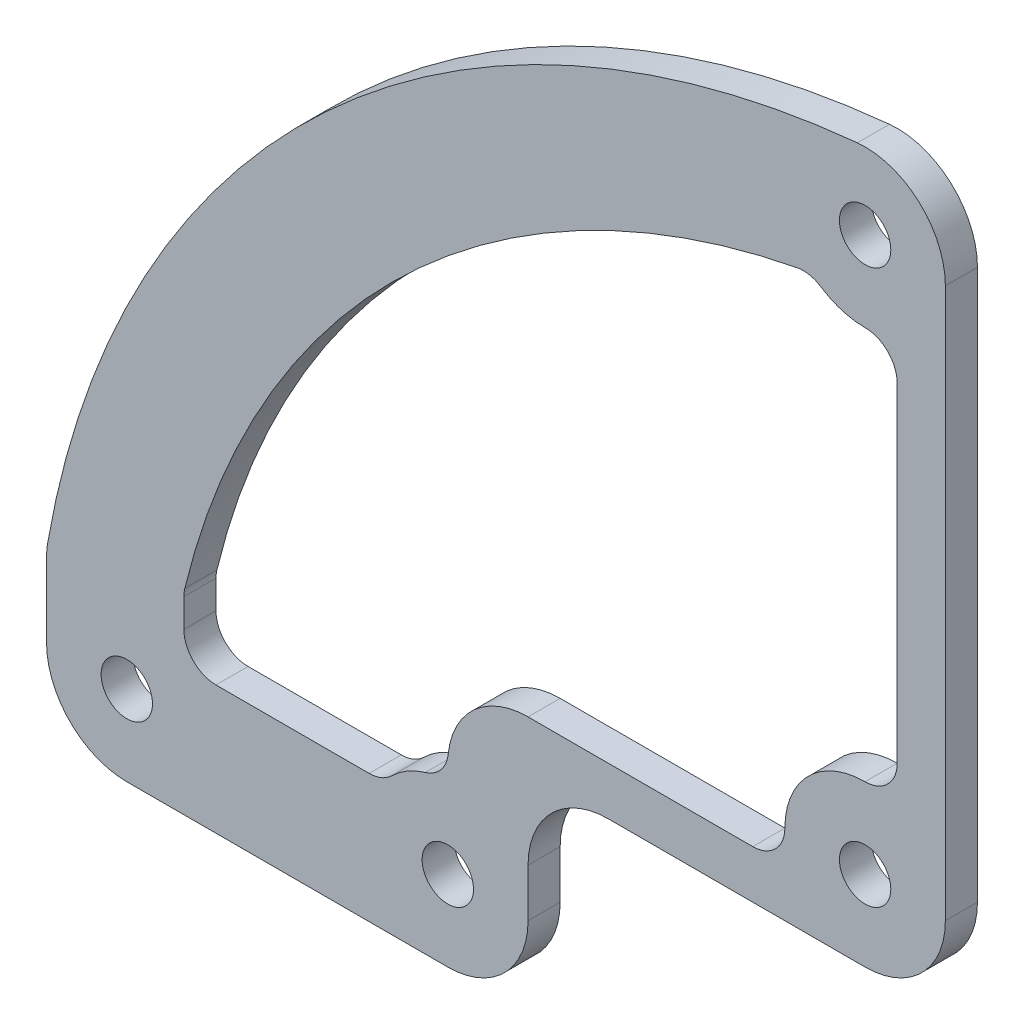
ISO-10303-21;
HEADER;
FILE_DESCRIPTION(('STEP AP214'),'2;1');
FILE_NAME('part.step','',(''),(''),'','','');
FILE_SCHEMA(('AUTOMOTIVE_DESIGN { 1 0 10303 214 1 1 1 1 }'));
ENDSEC;
DATA;
#1=APPLICATION_CONTEXT('core data for automotive mechanical design processes');
#2=APPLICATION_PROTOCOL_DEFINITION('international standard','automotive_design',2000,#1);
#3=PRODUCT_CONTEXT('',#1,'mechanical');
#4=PRODUCT('Part','Part','',(#3));
#5=PRODUCT_RELATED_PRODUCT_CATEGORY('part','',(#4));
#6=PRODUCT_DEFINITION_FORMATION('','',#4);
#7=PRODUCT_DEFINITION_CONTEXT('part definition',#1,'design');
#8=PRODUCT_DEFINITION('design','',#6,#7);
#9=PRODUCT_DEFINITION_SHAPE('','',#8);
#10=(LENGTH_UNIT() NAMED_UNIT(*) SI_UNIT(.MILLI.,.METRE.));
#11=(NAMED_UNIT(*) PLANE_ANGLE_UNIT() SI_UNIT($,.RADIAN.));
#12=(NAMED_UNIT(*) SI_UNIT($,.STERADIAN.) SOLID_ANGLE_UNIT());
#13=UNCERTAINTY_MEASURE_WITH_UNIT(LENGTH_MEASURE(1.E-05),#10,'distance_accuracy_value','');
#14=(GEOMETRIC_REPRESENTATION_CONTEXT(3) GLOBAL_UNCERTAINTY_ASSIGNED_CONTEXT((#13)) GLOBAL_UNIT_ASSIGNED_CONTEXT((#10,
#11,#12)) REPRESENTATION_CONTEXT('',''));
#15=CARTESIAN_POINT('',(0.,0.,0.));
#16=DIRECTION('',(0.,0.,1.));
#17=DIRECTION('',(1.,0.,0.));
#18=AXIS2_PLACEMENT_3D('',#15,#16,#17);
#19=CARTESIAN_POINT('',(26.,0.739473684210526,2.));
#20=DIRECTION('',(0.,0.,1.));
#21=DIRECTION('',(1.,0.,0.));
#22=AXIS2_PLACEMENT_3D('',#19,#20,#21);
#23=PLANE('',#22);
#24=CARTESIAN_POINT('',(21.,18.,2.));
#25=DIRECTION('',(0.,0.,1.));
#26=DIRECTION('',(1.,0.,0.));
#27=AXIS2_PLACEMENT_3D('',#24,#25,#26);
#28=CIRCLE('',#27,1.6);
#29=CARTESIAN_POINT('',(22.6,18.,2.));
#30=VERTEX_POINT('',#29);
#31=EDGE_CURVE('E481',#30,#30,#28,.T.);
#32=ORIENTED_EDGE('',*,*,#31,.F.);
#33=EDGE_LOOP('',(#32));
#34=FACE_BOUND('',#33,.T.);
#35=CARTESIAN_POINT('',(-25.,5.,2.));
#36=DIRECTION('',(0.,0.,1.));
#37=DIRECTION('',(1.,0.,0.));
#38=AXIS2_PLACEMENT_3D('',#35,#36,#37);
#39=CIRCLE('',#38,1.6);
#40=CARTESIAN_POINT('',(-23.4,5.,2.));
#41=VERTEX_POINT('',#40);
#42=EDGE_CURVE('E264',#41,#41,#39,.T.);
#43=ORIENTED_EDGE('',*,*,#42,.F.);
#44=EDGE_LOOP('',(#43));
#45=FACE_BOUND('',#44,.T.);
#46=DIRECTION('',(0.,1.,0.));
#47=VECTOR('',#46,1.);
#48=CARTESIAN_POINT('',(26.,13.,2.));
#49=LINE('',#48,#47);
#50=CARTESIAN_POINT('',(26.,18.,2.));
#51=VERTEX_POINT('',#50);
#52=CARTESIAN_POINT('',(26.,52.2579372141678,2.));
#53=VERTEX_POINT('',#52);
#54=EDGE_CURVE('E308',#51,#53,#49,.T.);
#55=ORIENTED_EDGE('',*,*,#54,.T.);
#56=CARTESIAN_POINT('',(21.,52.2579372141678,2.));
#57=DIRECTION('',(0.,0.,1.));
#58=DIRECTION('',(1.,0.,0.));
#59=AXIS2_PLACEMENT_3D('',#56,#57,#58);
#60=CIRCLE('',#59,5.);
#61=CARTESIAN_POINT('',(20.5170064568611,57.2345542616495,2.));
#62=VERTEX_POINT('',#61);
#63=EDGE_CURVE('E355',#53,#62,#60,.T.);
#64=ORIENTED_EDGE('',*,*,#63,.T.);
#65=CARTESIAN_POINT('',(26.,0.739473684210526,2.));
#66=DIRECTION('',(0.,0.,1.));
#67=DIRECTION('',(1.,0.,0.));
#68=AXIS2_PLACEMENT_3D('',#65,#66,#67);
#69=CIRCLE('',#68,56.7605263157895);
#70=CARTESIAN_POINT('',(-29.9265341400173,10.4338084592691,2.));
#71=VERTEX_POINT('',#70);
#72=EDGE_CURVE('E292',#62,#71,#69,.T.);
#73=ORIENTED_EDGE('',*,*,#72,.T.);
#74=CARTESIAN_POINT('',(-25.,9.57984044625919,2.));
#75=DIRECTION('',(0.,0.,1.));
#76=DIRECTION('',(1.,0.,0.));
#77=AXIS2_PLACEMENT_3D('',#74,#75,#76);
#78=CIRCLE('',#77,5.);
#79=CARTESIAN_POINT('',(-30.,9.57984044625919,2.));
#80=VERTEX_POINT('',#79);
#81=EDGE_CURVE('E347',#71,#80,#78,.T.);
#82=ORIENTED_EDGE('',*,*,#81,.T.);
#83=DIRECTION('',(0.,-1.,0.));
#84=VECTOR('',#83,1.);
#85=CARTESIAN_POINT('',(-30.,10.,2.));
#86=LINE('',#85,#84);
#87=CARTESIAN_POINT('',(-30.,5.,2.));
#88=VERTEX_POINT('',#87);
#89=EDGE_CURVE('E295',#80,#88,#86,.T.);
#90=ORIENTED_EDGE('',*,*,#89,.T.);
#91=CARTESIAN_POINT('',(-25.,5.,2.));
#92=DIRECTION('',(0.,0.,1.));
#93=DIRECTION('',(1.,0.,0.));
#94=AXIS2_PLACEMENT_3D('',#91,#92,#93);
#95=CIRCLE('',#94,5.);
#96=CARTESIAN_POINT('',(-25.,0.,2.));
#97=VERTEX_POINT('',#96);
#98=EDGE_CURVE('E349',#88,#97,#95,.T.);
#99=ORIENTED_EDGE('',*,*,#98,.T.);
#100=DIRECTION('',(1.,0.,0.));
#101=VECTOR('',#100,1.);
#102=CARTESIAN_POINT('',(-30.,0.,2.));
#103=LINE('',#102,#101);
#104=CARTESIAN_POINT('',(-5.,0.,2.));
#105=VERTEX_POINT('',#104);
#106=EDGE_CURVE('E299',#97,#105,#103,.T.);
#107=ORIENTED_EDGE('',*,*,#106,.T.);
#108=CARTESIAN_POINT('',(-5.,5.,2.));
#109=DIRECTION('',(0.,0.,1.));
#110=DIRECTION('',(1.,0.,0.));
#111=AXIS2_PLACEMENT_3D('',#108,#109,#110);
#112=CIRCLE('',#111,5.);
#113=CARTESIAN_POINT('',(0.,5.,2.));
#114=VERTEX_POINT('',#113);
#115=EDGE_CURVE('E351',#105,#114,#112,.T.);
#116=ORIENTED_EDGE('',*,*,#115,.T.);
#117=DIRECTION('',(0.,1.,0.));
#118=VECTOR('',#117,1.);
#119=CARTESIAN_POINT('',(0.,0.,2.));
#120=LINE('',#119,#118);
#121=CARTESIAN_POINT('',(0.,7.99999999999999,2.));
#122=VERTEX_POINT('',#121);
#123=EDGE_CURVE('E302',#114,#122,#120,.T.);
#124=ORIENTED_EDGE('',*,*,#123,.T.);
#125=CARTESIAN_POINT('',(5.,8.,2.));
#126=DIRECTION('',(0.,0.,1.));
#127=DIRECTION('',(1.,0.,0.));
#128=AXIS2_PLACEMENT_3D('',#125,#126,#127);
#129=CIRCLE('',#128,5.);
#130=CARTESIAN_POINT('',(5.,13.,2.));
#131=VERTEX_POINT('',#130);
#132=EDGE_CURVE('E379',#122,#131,#129,.F.);
#133=ORIENTED_EDGE('',*,*,#132,.T.);
#134=DIRECTION('',(1.,0.,0.));
#135=VECTOR('',#134,1.);
#136=CARTESIAN_POINT('',(0.,13.,2.));
#137=LINE('',#136,#135);
#138=CARTESIAN_POINT('',(21.,13.,2.));
#139=VERTEX_POINT('',#138);
#140=EDGE_CURVE('E305',#131,#139,#137,.T.);
#141=ORIENTED_EDGE('',*,*,#140,.T.);
#142=CARTESIAN_POINT('',(21.,18.,2.));
#143=DIRECTION('',(0.,0.,1.));
#144=DIRECTION('',(1.,0.,0.));
#145=AXIS2_PLACEMENT_3D('',#142,#143,#144);
#146=CIRCLE('',#145,5.);
#147=EDGE_CURVE('E353',#139,#51,#146,.T.);
#148=ORIENTED_EDGE('',*,*,#147,.T.);
#149=EDGE_LOOP('',(#55,#64,#73,#82,#90,#99,#107,#116,#124,#133,#141,#148));
#150=FACE_BOUND('',#149,.T.);
#151=DIRECTION('',(0.,-1.,0.));
#152=VECTOR('',#151,1.);
#153=CARTESIAN_POINT('',(-21.442485955989,8.,2.));
#154=LINE('',#153,#152);
#155=CARTESIAN_POINT('',(-21.442485955989,11.7634154234155,2.));
#156=VERTEX_POINT('',#155);
#157=CARTESIAN_POINT('',(-21.442485955989,10.,2.));
#158=VERTEX_POINT('',#157);
#159=EDGE_CURVE('E465',#156,#158,#154,.T.);
#160=ORIENTED_EDGE('',*,*,#159,.F.);
#161=CARTESIAN_POINT('',(-19.442485955989,11.7634154234155,2.));
#162=DIRECTION('',(0.,0.,1.));
#163=DIRECTION('',(1.,0.,0.));
#164=AXIS2_PLACEMENT_3D('',#161,#162,#163);
#165=CIRCLE('',#164,2.);
#166=CARTESIAN_POINT('',(-21.3861118959153,12.2349217390098,2.));
#167=VERTEX_POINT('',#166);
#168=EDGE_CURVE('E426',#156,#167,#165,.F.);
#169=ORIENTED_EDGE('',*,*,#168,.T.);
#170=CARTESIAN_POINT('',(26.,0.739473684210526,2.));
#171=DIRECTION('',(0.,0.,1.));
#172=DIRECTION('',(-1.,0.,0.));
#173=AXIS2_PLACEMENT_3D('',#170,#171,#172);
#174=CIRCLE('',#173,48.7605263157895);
#175=CARTESIAN_POINT('',(16.7702138952018,48.6184876157074,2.));
#176=VERTEX_POINT('',#175);
#177=EDGE_CURVE('E285',#176,#167,#174,.T.);
#178=ORIENTED_EDGE('',*,*,#177,.F.);
#179=CARTESIAN_POINT('',(17.1487900428432,46.654644419208,2.));
#180=DIRECTION('',(0.,0.,1.));
#181=DIRECTION('',(1.,0.,0.));
#182=AXIS2_PLACEMENT_3D('',#179,#180,#181);
#183=CIRCLE('',#182,2.);
#184=CARTESIAN_POINT('',(18.249135744888,48.32474601372,2.));
#185=VERTEX_POINT('',#184);
#186=EDGE_CURVE('E430',#176,#185,#183,.F.);
#187=ORIENTED_EDGE('',*,*,#186,.T.);
#188=CARTESIAN_POINT('',(21.,52.5,2.));
#189=DIRECTION('',(0.,0.,-1.));
#190=DIRECTION('',(-1.,0.,0.));
#191=AXIS2_PLACEMENT_3D('',#188,#189,#190);
#192=CIRCLE('',#191,5.);
#193=CARTESIAN_POINT('',(21.,47.5,2.));
#194=VERTEX_POINT('',#193);
#195=EDGE_CURVE('E256',#194,#185,#192,.T.);
#196=ORIENTED_EDGE('',*,*,#195,.F.);
#197=CARTESIAN_POINT('',(21.,45.5,2.));
#198=DIRECTION('',(0.,0.,1.));
#199=DIRECTION('',(1.,0.,0.));
#200=AXIS2_PLACEMENT_3D('',#197,#198,#199);
#201=CIRCLE('',#200,2.);
#202=CARTESIAN_POINT('',(23.,45.5,2.));
#203=VERTEX_POINT('',#202);
#204=EDGE_CURVE('E434',#194,#203,#201,.F.);
#205=ORIENTED_EDGE('',*,*,#204,.T.);
#206=DIRECTION('',(0.,1.,0.));
#207=VECTOR('',#206,1.);
#208=CARTESIAN_POINT('',(23.,23.,2.));
#209=LINE('',#208,#207);
#210=CARTESIAN_POINT('',(23.,25.,2.));
#211=VERTEX_POINT('',#210);
#212=EDGE_CURVE('E250',#211,#203,#209,.T.);
#213=ORIENTED_EDGE('',*,*,#212,.F.);
#214=CARTESIAN_POINT('',(21.,25.,2.));
#215=DIRECTION('',(0.,0.,1.));
#216=DIRECTION('',(1.,0.,0.));
#217=AXIS2_PLACEMENT_3D('',#214,#215,#216);
#218=CIRCLE('',#217,2.);
#219=CARTESIAN_POINT('',(21.,23.,2.));
#220=VERTEX_POINT('',#219);
#221=EDGE_CURVE('E11',#211,#220,#218,.F.);
#222=ORIENTED_EDGE('',*,*,#221,.T.);
#223=CARTESIAN_POINT('',(21.,18.,2.));
#224=DIRECTION('',(0.,0.,-1.));
#225=DIRECTION('',(-1.,0.,0.));
#226=AXIS2_PLACEMENT_3D('',#223,#224,#225);
#227=CIRCLE('',#226,5.);
#228=CARTESIAN_POINT('',(16.,18.,2.));
#229=VERTEX_POINT('',#228);
#230=EDGE_CURVE('E247',#229,#220,#227,.T.);
#231=ORIENTED_EDGE('',*,*,#230,.F.);
#232=CARTESIAN_POINT('',(14.,18.,2.));
#233=DIRECTION('',(0.,0.,1.));
#234=DIRECTION('',(1.,0.,0.));
#235=AXIS2_PLACEMENT_3D('',#232,#233,#234);
#236=CIRCLE('',#235,2.);
#237=CARTESIAN_POINT('',(14.,16.,2.));
#238=VERTEX_POINT('',#237);
#239=EDGE_CURVE('E48',#229,#238,#236,.F.);
#240=ORIENTED_EDGE('',*,*,#239,.T.);
#241=DIRECTION('',(1.,0.,0.));
#242=VECTOR('',#241,1.);
#243=CARTESIAN_POINT('',(0.,16.,2.));
#244=LINE('',#243,#242);
#245=CARTESIAN_POINT('',(0.,16.,2.));
#246=VERTEX_POINT('',#245);
#247=EDGE_CURVE('E235',#246,#238,#244,.T.);
#248=ORIENTED_EDGE('',*,*,#247,.F.);
#249=CARTESIAN_POINT('',(0.,11.,2.));
#250=DIRECTION('',(0.,0.,-1.));
#251=DIRECTION('',(1.,0.,0.));
#252=AXIS2_PLACEMENT_3D('',#249,#250,#251);
#253=CIRCLE('',#252,5.);
#254=CARTESIAN_POINT('',(-4.97354452366013,11.5136680554311,2.));
#255=VERTEX_POINT('',#254);
#256=EDGE_CURVE('E226',#255,#246,#253,.T.);
#257=ORIENTED_EDGE('',*,*,#256,.F.);
#258=CARTESIAN_POINT('',(-6.96296233312418,11.7191352776035,2.));
#259=DIRECTION('',(0.,0.,1.));
#260=DIRECTION('',(1.,0.,0.));
#261=AXIS2_PLACEMENT_3D('',#258,#259,#260);
#262=CIRCLE('',#261,2.);
#263=CARTESIAN_POINT('',(-6.40211595223156,9.79938234114535,2.));
#264=VERTEX_POINT('',#263);
#265=EDGE_CURVE('E414',#255,#264,#262,.F.);
#266=ORIENTED_EDGE('',*,*,#265,.T.);
#267=CARTESIAN_POINT('',(-5.,4.99999999999998,2.));
#268=DIRECTION('',(0.,0.,-1.));
#269=DIRECTION('',(-1.,0.,0.));
#270=AXIS2_PLACEMENT_3D('',#267,#268,#269);
#271=CIRCLE('',#270,5.00000000000002);
#272=CARTESIAN_POINT('',(-8.49927106111883,8.57142857142857,2.));
#273=VERTEX_POINT('',#272);
#274=EDGE_CURVE('E236',#273,#264,#271,.T.);
#275=ORIENTED_EDGE('',*,*,#274,.F.);
#276=CARTESIAN_POINT('',(-9.89897948556636,10.,2.));
#277=DIRECTION('',(0.,0.,1.));
#278=DIRECTION('',(1.,0.,0.));
#279=AXIS2_PLACEMENT_3D('',#276,#277,#278);
#280=CIRCLE('',#279,2.);
#281=CARTESIAN_POINT('',(-9.89897948556636,8.,2.));
#282=VERTEX_POINT('',#281);
#283=EDGE_CURVE('E418',#273,#282,#280,.F.);
#284=ORIENTED_EDGE('',*,*,#283,.T.);
#285=DIRECTION('',(1.,0.,0.));
#286=VECTOR('',#285,1.);
#287=CARTESIAN_POINT('',(-9.,8.,2.));
#288=LINE('',#287,#286);
#289=CARTESIAN_POINT('',(-19.442485955989,8.,2.));
#290=VERTEX_POINT('',#289);
#291=EDGE_CURVE('E463',#290,#282,#288,.T.);
#292=ORIENTED_EDGE('',*,*,#291,.F.);
#293=CARTESIAN_POINT('',(-19.442485955989,10.,2.));
#294=DIRECTION('',(0.,0.,1.));
#295=DIRECTION('',(1.,0.,0.));
#296=AXIS2_PLACEMENT_3D('',#293,#294,#295);
#297=CIRCLE('',#296,2.);
#298=EDGE_CURVE('E422',#290,#158,#297,.F.);
#299=ORIENTED_EDGE('',*,*,#298,.T.);
#300=EDGE_LOOP('',(#160,#169,#178,#187,#196,#205,#213,#222,#231,#240,#248,#257,#266,#275,#284,
#292,#299));
#301=FACE_BOUND('',#300,.T.);
#302=CARTESIAN_POINT('',(-5.,4.99999999999998,2.));
#303=DIRECTION('',(0.,0.,1.));
#304=DIRECTION('',(1.,0.,0.));
#305=AXIS2_PLACEMENT_3D('',#302,#303,#304);
#306=CIRCLE('',#305,1.6);
#307=CARTESIAN_POINT('',(-3.4,4.99999999999998,2.));
#308=VERTEX_POINT('',#307);
#309=EDGE_CURVE('E475',#308,#308,#306,.T.);
#310=ORIENTED_EDGE('',*,*,#309,.F.);
#311=EDGE_LOOP('',(#310));
#312=FACE_BOUND('',#311,.T.);
#313=CARTESIAN_POINT('',(21.,52.5,2.));
#314=DIRECTION('',(0.,0.,1.));
#315=DIRECTION('',(1.,0.,0.));
#316=AXIS2_PLACEMENT_3D('',#313,#314,#315);
#317=CIRCLE('',#316,1.6);
#318=CARTESIAN_POINT('',(22.6,52.5,2.));
#319=VERTEX_POINT('',#318);
#320=EDGE_CURVE('E487',#319,#319,#317,.T.);
#321=ORIENTED_EDGE('',*,*,#320,.F.);
#322=EDGE_LOOP('',(#321));
#323=FACE_BOUND('',#322,.T.);
#324=ADVANCED_FACE('F33',(#34,#45,#150,#301,#312,#323),#23,.T.);
#325=CARTESIAN_POINT('',(26.,0.739473684210526,0.));
#326=DIRECTION('',(0.,0.,1.));
#327=DIRECTION('',(1.,0.,0.));
#328=AXIS2_PLACEMENT_3D('',#325,#326,#327);
#329=PLANE('',#328);
#330=CARTESIAN_POINT('',(26.,0.739473684210526,0.));
#331=DIRECTION('',(0.,0.,1.));
#332=DIRECTION('',(1.,0.,0.));
#333=AXIS2_PLACEMENT_3D('',#330,#331,#332);
#334=CIRCLE('',#333,56.7605263157895);
#335=CARTESIAN_POINT('',(20.5170064568611,57.2345542616495,0.));
#336=VERTEX_POINT('',#335);
#337=CARTESIAN_POINT('',(-29.9265341400173,10.4338084592691,0.));
#338=VERTEX_POINT('',#337);
#339=EDGE_CURVE('E242',#336,#338,#334,.T.);
#340=ORIENTED_EDGE('',*,*,#339,.F.);
#341=CARTESIAN_POINT('',(21.,52.2579372141678,0.));
#342=DIRECTION('',(0.,0.,1.));
#343=DIRECTION('',(1.,0.,0.));
#344=AXIS2_PLACEMENT_3D('',#341,#342,#343);
#345=CIRCLE('',#344,5.);
#346=CARTESIAN_POINT('',(26.,52.2579372141678,0.));
#347=VERTEX_POINT('',#346);
#348=EDGE_CURVE('E340',#336,#347,#345,.F.);
#349=ORIENTED_EDGE('',*,*,#348,.T.);
#350=DIRECTION('',(0.,1.,0.));
#351=VECTOR('',#350,1.);
#352=CARTESIAN_POINT('',(26.,13.,0.));
#353=LINE('',#352,#351);
#354=CARTESIAN_POINT('',(26.,18.,0.));
#355=VERTEX_POINT('',#354);
#356=EDGE_CURVE('E296',#355,#347,#353,.T.);
#357=ORIENTED_EDGE('',*,*,#356,.F.);
#358=CARTESIAN_POINT('',(21.,18.,0.));
#359=DIRECTION('',(0.,0.,1.));
#360=DIRECTION('',(1.,0.,0.));
#361=AXIS2_PLACEMENT_3D('',#358,#359,#360);
#362=CIRCLE('',#361,5.);
#363=CARTESIAN_POINT('',(21.,13.,0.));
#364=VERTEX_POINT('',#363);
#365=EDGE_CURVE('E338',#355,#364,#362,.F.);
#366=ORIENTED_EDGE('',*,*,#365,.T.);
#367=DIRECTION('',(1.,0.,0.));
#368=VECTOR('',#367,1.);
#369=CARTESIAN_POINT('',(0.,13.,0.));
#370=LINE('',#369,#368);
#371=CARTESIAN_POINT('',(5.,13.,0.));
#372=VERTEX_POINT('',#371);
#373=EDGE_CURVE('E323',#372,#364,#370,.T.);
#374=ORIENTED_EDGE('',*,*,#373,.F.);
#375=CARTESIAN_POINT('',(5.,8.,0.));
#376=DIRECTION('',(0.,0.,1.));
#377=DIRECTION('',(1.,0.,0.));
#378=AXIS2_PLACEMENT_3D('',#375,#376,#377);
#379=CIRCLE('',#378,5.);
#380=CARTESIAN_POINT('',(0.,7.99999999999999,0.));
#381=VERTEX_POINT('',#380);
#382=EDGE_CURVE('E377',#372,#381,#379,.T.);
#383=ORIENTED_EDGE('',*,*,#382,.T.);
#384=DIRECTION('',(0.,1.,0.));
#385=VECTOR('',#384,1.);
#386=CARTESIAN_POINT('',(0.,0.,0.));
#387=LINE('',#386,#385);
#388=CARTESIAN_POINT('',(0.,5.,0.));
#389=VERTEX_POINT('',#388);
#390=EDGE_CURVE('E320',#389,#381,#387,.T.);
#391=ORIENTED_EDGE('',*,*,#390,.F.);
#392=CARTESIAN_POINT('',(-5.,5.,0.));
#393=DIRECTION('',(0.,0.,1.));
#394=DIRECTION('',(1.,0.,0.));
#395=AXIS2_PLACEMENT_3D('',#392,#393,#394);
#396=CIRCLE('',#395,5.);
#397=CARTESIAN_POINT('',(-5.,0.,0.));
#398=VERTEX_POINT('',#397);
#399=EDGE_CURVE('E336',#389,#398,#396,.F.);
#400=ORIENTED_EDGE('',*,*,#399,.T.);
#401=DIRECTION('',(1.,0.,0.));
#402=VECTOR('',#401,1.);
#403=CARTESIAN_POINT('',(-30.,0.,0.));
#404=LINE('',#403,#402);
#405=CARTESIAN_POINT('',(-25.,0.,0.));
#406=VERTEX_POINT('',#405);
#407=EDGE_CURVE('E317',#406,#398,#404,.T.);
#408=ORIENTED_EDGE('',*,*,#407,.F.);
#409=CARTESIAN_POINT('',(-25.,5.,0.));
#410=DIRECTION('',(0.,0.,1.));
#411=DIRECTION('',(1.,0.,0.));
#412=AXIS2_PLACEMENT_3D('',#409,#410,#411);
#413=CIRCLE('',#412,5.);
#414=CARTESIAN_POINT('',(-30.,5.,0.));
#415=VERTEX_POINT('',#414);
#416=EDGE_CURVE('E334',#406,#415,#413,.F.);
#417=ORIENTED_EDGE('',*,*,#416,.T.);
#418=DIRECTION('',(0.,-1.,0.));
#419=VECTOR('',#418,1.);
#420=CARTESIAN_POINT('',(-30.,10.,0.));
#421=LINE('',#420,#419);
#422=CARTESIAN_POINT('',(-30.,9.57984044625919,0.));
#423=VERTEX_POINT('',#422);
#424=EDGE_CURVE('E314',#423,#415,#421,.T.);
#425=ORIENTED_EDGE('',*,*,#424,.F.);
#426=CARTESIAN_POINT('',(-25.,9.57984044625919,0.));
#427=DIRECTION('',(0.,0.,1.));
#428=DIRECTION('',(1.,0.,0.));
#429=AXIS2_PLACEMENT_3D('',#426,#427,#428);
#430=CIRCLE('',#429,5.);
#431=EDGE_CURVE('E332',#423,#338,#430,.F.);
#432=ORIENTED_EDGE('',*,*,#431,.T.);
#433=EDGE_LOOP('',(#340,#349,#357,#366,#374,#383,#391,#400,#408,#417,#425,#432));
#434=FACE_BOUND('',#433,.T.);
#435=CARTESIAN_POINT('',(21.,52.5,0.));
#436=DIRECTION('',(0.,0.,-1.));
#437=DIRECTION('',(-1.,0.,0.));
#438=AXIS2_PLACEMENT_3D('',#435,#436,#437);
#439=CIRCLE('',#438,5.);
#440=CARTESIAN_POINT('',(21.,47.5,0.));
#441=VERTEX_POINT('',#440);
#442=CARTESIAN_POINT('',(18.249135744888,48.32474601372,0.));
#443=VERTEX_POINT('',#442);
#444=EDGE_CURVE('E282',#441,#443,#439,.T.);
#445=ORIENTED_EDGE('',*,*,#444,.T.);
#446=CARTESIAN_POINT('',(17.1487900428432,46.654644419208,0.));
#447=DIRECTION('',(0.,0.,1.));
#448=DIRECTION('',(1.,0.,0.));
#449=AXIS2_PLACEMENT_3D('',#446,#447,#448);
#450=CIRCLE('',#449,2.);
#451=CARTESIAN_POINT('',(16.7702138952018,48.6184876157074,0.));
#452=VERTEX_POINT('',#451);
#453=EDGE_CURVE('E428',#443,#452,#450,.T.);
#454=ORIENTED_EDGE('',*,*,#453,.T.);
#455=CARTESIAN_POINT('',(26.,0.739473684210526,0.));
#456=DIRECTION('',(0.,0.,1.));
#457=DIRECTION('',(-1.,0.,0.));
#458=AXIS2_PLACEMENT_3D('',#455,#456,#457);
#459=CIRCLE('',#458,48.7605263157895);
#460=CARTESIAN_POINT('',(-21.3861118959153,12.2349217390098,0.));
#461=VERTEX_POINT('',#460);
#462=EDGE_CURVE('E260',#452,#461,#459,.T.);
#463=ORIENTED_EDGE('',*,*,#462,.T.);
#464=CARTESIAN_POINT('',(-19.442485955989,11.7634154234155,0.));
#465=DIRECTION('',(0.,0.,1.));
#466=DIRECTION('',(1.,0.,0.));
#467=AXIS2_PLACEMENT_3D('',#464,#465,#466);
#468=CIRCLE('',#467,2.);
#469=CARTESIAN_POINT('',(-21.442485955989,11.7634154234155,0.));
#470=VERTEX_POINT('',#469);
#471=EDGE_CURVE('E424',#461,#470,#468,.T.);
#472=ORIENTED_EDGE('',*,*,#471,.T.);
#473=DIRECTION('',(0.,-1.,0.));
#474=VECTOR('',#473,1.);
#475=CARTESIAN_POINT('',(-21.442485955989,8.,0.));
#476=LINE('',#475,#474);
#477=CARTESIAN_POINT('',(-21.442485955989,10.,0.));
#478=VERTEX_POINT('',#477);
#479=EDGE_CURVE('E263',#470,#478,#476,.T.);
#480=ORIENTED_EDGE('',*,*,#479,.T.);
#481=CARTESIAN_POINT('',(-19.442485955989,10.,0.));
#482=DIRECTION('',(0.,0.,1.));
#483=DIRECTION('',(1.,0.,0.));
#484=AXIS2_PLACEMENT_3D('',#481,#482,#483);
#485=CIRCLE('',#484,2.);
#486=CARTESIAN_POINT('',(-19.442485955989,8.,0.));
#487=VERTEX_POINT('',#486);
#488=EDGE_CURVE('E420',#478,#487,#485,.T.);
#489=ORIENTED_EDGE('',*,*,#488,.T.);
#490=DIRECTION('',(1.,0.,0.));
#491=VECTOR('',#490,1.);
#492=CARTESIAN_POINT('',(-9.,8.,0.));
#493=LINE('',#492,#491);
#494=CARTESIAN_POINT('',(-9.89897948556636,8.,0.));
#495=VERTEX_POINT('',#494);
#496=EDGE_CURVE('E267',#487,#495,#493,.T.);
#497=ORIENTED_EDGE('',*,*,#496,.T.);
#498=CARTESIAN_POINT('',(-9.89897948556636,10.,0.));
#499=DIRECTION('',(0.,0.,1.));
#500=DIRECTION('',(1.,0.,0.));
#501=AXIS2_PLACEMENT_3D('',#498,#499,#500);
#502=CIRCLE('',#501,2.);
#503=CARTESIAN_POINT('',(-8.49927106111883,8.57142857142857,0.));
#504=VERTEX_POINT('',#503);
#505=EDGE_CURVE('E416',#495,#504,#502,.T.);
#506=ORIENTED_EDGE('',*,*,#505,.T.);
#507=CARTESIAN_POINT('',(-5.,4.99999999999998,0.));
#508=DIRECTION('',(0.,0.,-1.));
#509=DIRECTION('',(-1.,0.,0.));
#510=AXIS2_PLACEMENT_3D('',#507,#508,#509);
#511=CIRCLE('',#510,5.00000000000002);
#512=CARTESIAN_POINT('',(-6.40211595223156,9.79938234114535,0.));
#513=VERTEX_POINT('',#512);
#514=EDGE_CURVE('E270',#504,#513,#511,.T.);
#515=ORIENTED_EDGE('',*,*,#514,.T.);
#516=CARTESIAN_POINT('',(-6.96296233312418,11.7191352776035,0.));
#517=DIRECTION('',(0.,0.,1.));
#518=DIRECTION('',(1.,0.,0.));
#519=AXIS2_PLACEMENT_3D('',#516,#517,#518);
#520=CIRCLE('',#519,2.);
#521=CARTESIAN_POINT('',(-4.97354452366013,11.5136680554311,0.));
#522=VERTEX_POINT('',#521);
#523=EDGE_CURVE('E412',#513,#522,#520,.T.);
#524=ORIENTED_EDGE('',*,*,#523,.T.);
#525=CARTESIAN_POINT('',(0.,11.,0.));
#526=DIRECTION('',(0.,0.,-1.));
#527=DIRECTION('',(1.,0.,0.));
#528=AXIS2_PLACEMENT_3D('',#525,#526,#527);
#529=CIRCLE('',#528,5.);
#530=CARTESIAN_POINT('',(0.,16.,0.));
#531=VERTEX_POINT('',#530);
#532=EDGE_CURVE('E273',#522,#531,#529,.T.);
#533=ORIENTED_EDGE('',*,*,#532,.T.);
#534=DIRECTION('',(1.,0.,0.));
#535=VECTOR('',#534,1.);
#536=CARTESIAN_POINT('',(0.,16.,0.));
#537=LINE('',#536,#535);
#538=CARTESIAN_POINT('',(14.,16.,0.));
#539=VERTEX_POINT('',#538);
#540=EDGE_CURVE('E241',#531,#539,#537,.T.);
#541=ORIENTED_EDGE('',*,*,#540,.T.);
#542=CARTESIAN_POINT('',(14.,18.,0.));
#543=DIRECTION('',(0.,0.,1.));
#544=DIRECTION('',(1.,0.,0.));
#545=AXIS2_PLACEMENT_3D('',#542,#543,#544);
#546=CIRCLE('',#545,2.);
#547=CARTESIAN_POINT('',(16.,18.,0.));
#548=VERTEX_POINT('',#547);
#549=EDGE_CURVE('E56',#539,#548,#546,.T.);
#550=ORIENTED_EDGE('',*,*,#549,.T.);
#551=CARTESIAN_POINT('',(21.,18.,0.));
#552=DIRECTION('',(0.,0.,-1.));
#553=DIRECTION('',(-1.,0.,0.));
#554=AXIS2_PLACEMENT_3D('',#551,#552,#553);
#555=CIRCLE('',#554,5.);
#556=CARTESIAN_POINT('',(21.,23.,0.));
#557=VERTEX_POINT('',#556);
#558=EDGE_CURVE('E276',#548,#557,#555,.T.);
#559=ORIENTED_EDGE('',*,*,#558,.T.);
#560=CARTESIAN_POINT('',(21.,25.,0.));
#561=DIRECTION('',(0.,0.,1.));
#562=DIRECTION('',(1.,0.,0.));
#563=AXIS2_PLACEMENT_3D('',#560,#561,#562);
#564=CIRCLE('',#563,2.);
#565=CARTESIAN_POINT('',(23.,25.,0.));
#566=VERTEX_POINT('',#565);
#567=EDGE_CURVE('E41',#557,#566,#564,.T.);
#568=ORIENTED_EDGE('',*,*,#567,.T.);
#569=DIRECTION('',(0.,1.,0.));
#570=VECTOR('',#569,1.);
#571=CARTESIAN_POINT('',(23.,23.,0.));
#572=LINE('',#571,#570);
#573=CARTESIAN_POINT('',(23.,45.5,0.));
#574=VERTEX_POINT('',#573);
#575=EDGE_CURVE('E279',#566,#574,#572,.T.);
#576=ORIENTED_EDGE('',*,*,#575,.T.);
#577=CARTESIAN_POINT('',(21.,45.5,0.));
#578=DIRECTION('',(0.,0.,1.));
#579=DIRECTION('',(1.,0.,0.));
#580=AXIS2_PLACEMENT_3D('',#577,#578,#579);
#581=CIRCLE('',#580,2.);
#582=EDGE_CURVE('E432',#574,#441,#581,.T.);
#583=ORIENTED_EDGE('',*,*,#582,.T.);
#584=EDGE_LOOP('',(#445,#454,#463,#472,#480,#489,#497,#506,#515,#524,#533,#541,#550,#559,#568,
#576,#583));
#585=FACE_BOUND('',#584,.T.);
#586=CARTESIAN_POINT('',(-25.,5.,0.));
#587=DIRECTION('',(0.,0.,1.));
#588=DIRECTION('',(1.,0.,0.));
#589=AXIS2_PLACEMENT_3D('',#586,#587,#588);
#590=CIRCLE('',#589,1.6);
#591=CARTESIAN_POINT('',(-23.4,5.,0.));
#592=VERTEX_POINT('',#591);
#593=EDGE_CURVE('E472',#592,#592,#590,.T.);
#594=ORIENTED_EDGE('',*,*,#593,.T.);
#595=EDGE_LOOP('',(#594));
#596=FACE_BOUND('',#595,.T.);
#597=CARTESIAN_POINT('',(-5.,4.99999999999998,0.));
#598=DIRECTION('',(0.,0.,1.));
#599=DIRECTION('',(1.,0.,0.));
#600=AXIS2_PLACEMENT_3D('',#597,#598,#599);
#601=CIRCLE('',#600,1.6);
#602=CARTESIAN_POINT('',(-3.4,4.99999999999998,0.));
#603=VERTEX_POINT('',#602);
#604=EDGE_CURVE('E478',#603,#603,#601,.T.);
#605=ORIENTED_EDGE('',*,*,#604,.T.);
#606=EDGE_LOOP('',(#605));
#607=FACE_BOUND('',#606,.T.);
#608=CARTESIAN_POINT('',(21.,18.,0.));
#609=DIRECTION('',(0.,0.,1.));
#610=DIRECTION('',(1.,0.,0.));
#611=AXIS2_PLACEMENT_3D('',#608,#609,#610);
#612=CIRCLE('',#611,1.6);
#613=CARTESIAN_POINT('',(22.6,18.,0.));
#614=VERTEX_POINT('',#613);
#615=EDGE_CURVE('E484',#614,#614,#612,.T.);
#616=ORIENTED_EDGE('',*,*,#615,.T.);
#617=EDGE_LOOP('',(#616));
#618=FACE_BOUND('',#617,.T.);
#619=CARTESIAN_POINT('',(21.,52.5,0.));
#620=DIRECTION('',(0.,0.,1.));
#621=DIRECTION('',(1.,0.,0.));
#622=AXIS2_PLACEMENT_3D('',#619,#620,#621);
#623=CIRCLE('',#622,1.6);
#624=CARTESIAN_POINT('',(22.6,52.5,0.));
#625=VERTEX_POINT('',#624);
#626=EDGE_CURVE('E490',#625,#625,#623,.T.);
#627=ORIENTED_EDGE('',*,*,#626,.T.);
#628=EDGE_LOOP('',(#627));
#629=FACE_BOUND('',#628,.T.);
#630=ADVANCED_FACE('F439',(#434,#585,#596,#607,#618,#629),#329,.F.);
#631=CARTESIAN_POINT('',(26.,0.739473684210526,2.));
#632=DIRECTION('',(0.,0.,-1.));
#633=DIRECTION('',(-1.,0.,0.));
#634=AXIS2_PLACEMENT_3D('',#631,#632,#633);
#635=CYLINDRICAL_SURFACE('',#634,56.7605263157895);
#636=ORIENTED_EDGE('',*,*,#72,.F.);
#637=DIRECTION('',(0.,0.,-1.));
#638=VECTOR('',#637,1.);
#639=CARTESIAN_POINT('',(20.5170064568611,57.2345542616495,2.));
#640=LINE('',#639,#638);
#641=EDGE_CURVE('E329',#62,#336,#640,.T.);
#642=ORIENTED_EDGE('',*,*,#641,.T.);
#643=ORIENTED_EDGE('',*,*,#339,.T.);
#644=DIRECTION('',(0.,0.,-1.));
#645=VECTOR('',#644,1.);
#646=CARTESIAN_POINT('',(-29.9265341400173,10.4338084592691,2.));
#647=LINE('',#646,#645);
#648=EDGE_CURVE('E311',#338,#71,#647,.F.);
#649=ORIENTED_EDGE('',*,*,#648,.T.);
#650=EDGE_LOOP('',(#636,#642,#643,#649));
#651=FACE_BOUND('',#650,.T.);
#652=ADVANCED_FACE('F505',(#651),#635,.T.);
#653=CARTESIAN_POINT('',(-30.,10.,2.));
#654=DIRECTION('',(1.,0.,0.));
#655=DIRECTION('',(0.,0.,-1.));
#656=AXIS2_PLACEMENT_3D('',#653,#654,#655);
#657=PLANE('',#656);
#658=ORIENTED_EDGE('',*,*,#424,.T.);
#659=DIRECTION('',(0.,0.,-1.));
#660=VECTOR('',#659,1.);
#661=CARTESIAN_POINT('',(-30.,5.,2.));
#662=LINE('',#661,#660);
#663=EDGE_CURVE('E375',#415,#88,#662,.F.);
#664=ORIENTED_EDGE('',*,*,#663,.T.);
#665=ORIENTED_EDGE('',*,*,#89,.F.);
#666=DIRECTION('',(0.,0.,-1.));
#667=VECTOR('',#666,1.);
#668=CARTESIAN_POINT('',(-30.,9.57984044625919,2.));
#669=LINE('',#668,#667);
#670=EDGE_CURVE('E372',#80,#423,#669,.T.);
#671=ORIENTED_EDGE('',*,*,#670,.T.);
#672=EDGE_LOOP('',(#658,#664,#665,#671));
#673=FACE_BOUND('',#672,.T.);
#674=ADVANCED_FACE('F529',(#673),#657,.F.);
#675=CARTESIAN_POINT('',(-30.,0.,2.));
#676=DIRECTION('',(0.,1.,0.));
#677=DIRECTION('',(0.,0.,1.));
#678=AXIS2_PLACEMENT_3D('',#675,#676,#677);
#679=PLANE('',#678);
#680=ORIENTED_EDGE('',*,*,#407,.T.);
#681=DIRECTION('',(0.,0.,-1.));
#682=VECTOR('',#681,1.);
#683=CARTESIAN_POINT('',(-5.,0.,2.));
#684=LINE('',#683,#682);
#685=EDGE_CURVE('E370',#398,#105,#684,.F.);
#686=ORIENTED_EDGE('',*,*,#685,.T.);
#687=ORIENTED_EDGE('',*,*,#106,.F.);
#688=DIRECTION('',(0.,0.,-1.));
#689=VECTOR('',#688,1.);
#690=CARTESIAN_POINT('',(-25.,0.,2.));
#691=LINE('',#690,#689);
#692=EDGE_CURVE('E367',#97,#406,#691,.T.);
#693=ORIENTED_EDGE('',*,*,#692,.T.);
#694=EDGE_LOOP('',(#680,#686,#687,#693));
#695=FACE_BOUND('',#694,.T.);
#696=ADVANCED_FACE('F525',(#695),#679,.F.);
#697=CARTESIAN_POINT('',(0.,0.,2.));
#698=DIRECTION('',(-1.,0.,0.));
#699=DIRECTION('',(0.,-1.,0.));
#700=AXIS2_PLACEMENT_3D('',#697,#698,#699);
#701=PLANE('',#700);
#702=ORIENTED_EDGE('',*,*,#390,.T.);
#703=DIRECTION('',(0.,0.,-1.));
#704=VECTOR('',#703,1.);
#705=CARTESIAN_POINT('',(0.,8.,2.));
#706=LINE('',#705,#704);
#707=EDGE_CURVE('E365',#381,#122,#706,.F.);
#708=ORIENTED_EDGE('',*,*,#707,.T.);
#709=ORIENTED_EDGE('',*,*,#123,.F.);
#710=DIRECTION('',(0.,0.,-1.));
#711=VECTOR('',#710,1.);
#712=CARTESIAN_POINT('',(0.,5.,2.));
#713=LINE('',#712,#711);
#714=EDGE_CURVE('E362',#114,#389,#713,.T.);
#715=ORIENTED_EDGE('',*,*,#714,.T.);
#716=EDGE_LOOP('',(#702,#708,#709,#715));
#717=FACE_BOUND('',#716,.T.);
#718=ADVANCED_FACE('F521',(#717),#701,.F.);
#719=CARTESIAN_POINT('',(0.,13.,2.));
#720=DIRECTION('',(0.,1.,0.));
#721=DIRECTION('',(0.,0.,1.));
#722=AXIS2_PLACEMENT_3D('',#719,#720,#721);
#723=PLANE('',#722);
#724=ORIENTED_EDGE('',*,*,#373,.T.);
#725=DIRECTION('',(0.,0.,-1.));
#726=VECTOR('',#725,1.);
#727=CARTESIAN_POINT('',(21.,13.,2.));
#728=LINE('',#727,#726);
#729=EDGE_CURVE('E360',#364,#139,#728,.F.);
#730=ORIENTED_EDGE('',*,*,#729,.T.);
#731=ORIENTED_EDGE('',*,*,#140,.F.);
#732=DIRECTION('',(0.,0.,-1.));
#733=VECTOR('',#732,1.);
#734=CARTESIAN_POINT('',(5.,13.,0.));
#735=LINE('',#734,#733);
#736=EDGE_CURVE('E357',#131,#372,#735,.T.);
#737=ORIENTED_EDGE('',*,*,#736,.T.);
#738=EDGE_LOOP('',(#724,#730,#731,#737));
#739=FACE_BOUND('',#738,.T.);
#740=ADVANCED_FACE('F517',(#739),#723,.F.);
#741=CARTESIAN_POINT('',(26.,13.,2.));
#742=DIRECTION('',(-1.,0.,0.));
#743=DIRECTION('',(0.,0.,1.));
#744=AXIS2_PLACEMENT_3D('',#741,#742,#743);
#745=PLANE('',#744);
#746=ORIENTED_EDGE('',*,*,#356,.T.);
#747=DIRECTION('',(0.,0.,-1.));
#748=VECTOR('',#747,1.);
#749=CARTESIAN_POINT('',(26.,52.2579372141678,2.));
#750=LINE('',#749,#748);
#751=EDGE_CURVE('E345',#347,#53,#750,.F.);
#752=ORIENTED_EDGE('',*,*,#751,.T.);
#753=ORIENTED_EDGE('',*,*,#54,.F.);
#754=DIRECTION('',(0.,0.,-1.));
#755=VECTOR('',#754,1.);
#756=CARTESIAN_POINT('',(26.,18.,2.));
#757=LINE('',#756,#755);
#758=EDGE_CURVE('E342',#51,#355,#757,.T.);
#759=ORIENTED_EDGE('',*,*,#758,.T.);
#760=EDGE_LOOP('',(#746,#752,#753,#759));
#761=FACE_BOUND('',#760,.T.);
#762=ADVANCED_FACE('F514',(#761),#745,.F.);
#763=CARTESIAN_POINT('',(26.,0.739473684210526,2.));
#764=DIRECTION('',(0.,0.,-1.));
#765=DIRECTION('',(-1.,0.,0.));
#766=AXIS2_PLACEMENT_3D('',#763,#764,#765);
#767=CYLINDRICAL_SURFACE('',#766,48.7605263157895);
#768=ORIENTED_EDGE('',*,*,#177,.T.);
#769=DIRECTION('',(0.,0.,-1.));
#770=VECTOR('',#769,1.);
#771=CARTESIAN_POINT('',(-21.3861118959153,12.2349217390098,2.));
#772=LINE('',#771,#770);
#773=EDGE_CURVE('E399',#167,#461,#772,.T.);
#774=ORIENTED_EDGE('',*,*,#773,.T.);
#775=ORIENTED_EDGE('',*,*,#462,.F.);
#776=DIRECTION('',(0.,0.,-1.));
#777=VECTOR('',#776,1.);
#778=CARTESIAN_POINT('',(16.7702138952018,48.6184876157074,2.));
#779=LINE('',#778,#777);
#780=EDGE_CURVE('E397',#452,#176,#779,.F.);
#781=ORIENTED_EDGE('',*,*,#780,.T.);
#782=EDGE_LOOP('',(#768,#774,#775,#781));
#783=FACE_BOUND('',#782,.T.);
#784=ADVANCED_FACE('F511',(#783),#767,.F.);
#785=CARTESIAN_POINT('',(-21.442485955989,8.,2.));
#786=DIRECTION('',(1.,0.,0.));
#787=DIRECTION('',(0.,0.,-1.));
#788=AXIS2_PLACEMENT_3D('',#785,#786,#787);
#789=PLANE('',#788);
#790=ORIENTED_EDGE('',*,*,#159,.T.);
#791=DIRECTION('',(0.,0.,-1.));
#792=VECTOR('',#791,1.);
#793=CARTESIAN_POINT('',(-21.442485955989,10.,0.));
#794=LINE('',#793,#792);
#795=EDGE_CURVE('E394',#158,#478,#794,.T.);
#796=ORIENTED_EDGE('',*,*,#795,.T.);
#797=ORIENTED_EDGE('',*,*,#479,.F.);
#798=DIRECTION('',(0.,0.,1.));
#799=VECTOR('',#798,1.);
#800=CARTESIAN_POINT('',(-21.442485955989,11.7634154234155,2.));
#801=LINE('',#800,#799);
#802=EDGE_CURVE('E392',#470,#156,#801,.T.);
#803=ORIENTED_EDGE('',*,*,#802,.T.);
#804=EDGE_LOOP('',(#790,#796,#797,#803));
#805=FACE_BOUND('',#804,.T.);
#806=ADVANCED_FACE('F692',(#805),#789,.T.);
#807=CARTESIAN_POINT('',(-9.,8.,2.));
#808=DIRECTION('',(0.,1.,0.));
#809=DIRECTION('',(0.,0.,1.));
#810=AXIS2_PLACEMENT_3D('',#807,#808,#809);
#811=PLANE('',#810);
#812=ORIENTED_EDGE('',*,*,#291,.T.);
#813=DIRECTION('',(0.,0.,1.));
#814=VECTOR('',#813,1.);
#815=CARTESIAN_POINT('',(-9.89897948556636,8.,0.));
#816=LINE('',#815,#814);
#817=EDGE_CURVE('E389',#282,#495,#816,.F.);
#818=ORIENTED_EDGE('',*,*,#817,.T.);
#819=ORIENTED_EDGE('',*,*,#496,.F.);
#820=DIRECTION('',(0.,0.,-1.));
#821=VECTOR('',#820,1.);
#822=CARTESIAN_POINT('',(-19.442485955989,8.,2.));
#823=LINE('',#822,#821);
#824=EDGE_CURVE('E387',#487,#290,#823,.F.);
#825=ORIENTED_EDGE('',*,*,#824,.T.);
#826=EDGE_LOOP('',(#812,#818,#819,#825));
#827=FACE_BOUND('',#826,.T.);
#828=ADVANCED_FACE('F683',(#827),#811,.T.);
#829=CARTESIAN_POINT('',(-5.,4.99999999999998,2.));
#830=DIRECTION('',(0.,0.,-1.));
#831=DIRECTION('',(-1.,0.,0.));
#832=AXIS2_PLACEMENT_3D('',#829,#830,#831);
#833=CYLINDRICAL_SURFACE('',#832,5.00000000000002);
#834=ORIENTED_EDGE('',*,*,#274,.T.);
#835=DIRECTION('',(0.,0.,-1.));
#836=VECTOR('',#835,1.);
#837=CARTESIAN_POINT('',(-6.40211595223156,9.79938234114535,2.));
#838=LINE('',#837,#836);
#839=EDGE_CURVE('E383',#264,#513,#838,.T.);
#840=ORIENTED_EDGE('',*,*,#839,.T.);
#841=ORIENTED_EDGE('',*,*,#514,.F.);
#842=DIRECTION('',(0.,0.,-1.));
#843=VECTOR('',#842,1.);
#844=CARTESIAN_POINT('',(-8.49927106111883,8.57142857142857,2.));
#845=LINE('',#844,#843);
#846=EDGE_CURVE('E381',#504,#273,#845,.F.);
#847=ORIENTED_EDGE('',*,*,#846,.T.);
#848=EDGE_LOOP('',(#834,#840,#841,#847));
#849=FACE_BOUND('',#848,.T.);
#850=ADVANCED_FACE('F460',(#849),#833,.T.);
#851=CARTESIAN_POINT('',(0.,11.,2.));
#852=DIRECTION('',(0.,0.,-1.));
#853=DIRECTION('',(-1.,0.,0.));
#854=AXIS2_PLACEMENT_3D('',#851,#852,#853);
#855=CYLINDRICAL_SURFACE('',#854,5.);
#856=ORIENTED_EDGE('',*,*,#532,.F.);
#857=DIRECTION('',(0.,0.,-1.));
#858=VECTOR('',#857,1.);
#859=CARTESIAN_POINT('',(-4.97354452366013,11.5136680554311,2.));
#860=LINE('',#859,#858);
#861=EDGE_CURVE('E233',#522,#255,#860,.F.);
#862=ORIENTED_EDGE('',*,*,#861,.T.);
#863=ORIENTED_EDGE('',*,*,#256,.T.);
#864=DIRECTION('',(0.,0.,-1.));
#865=VECTOR('',#864,1.);
#866=CARTESIAN_POINT('',(0.,16.,2.));
#867=LINE('',#866,#865);
#868=EDGE_CURVE('E230',#246,#531,#867,.T.);
#869=ORIENTED_EDGE('',*,*,#868,.T.);
#870=EDGE_LOOP('',(#856,#862,#863,#869));
#871=FACE_BOUND('',#870,.T.);
#872=ADVANCED_FACE('F229',(#871),#855,.T.);
#873=CARTESIAN_POINT('',(0.,16.,2.));
#874=DIRECTION('',(0.,1.,0.));
#875=DIRECTION('',(0.,0.,1.));
#876=AXIS2_PLACEMENT_3D('',#873,#874,#875);
#877=PLANE('',#876);
#878=ORIENTED_EDGE('',*,*,#247,.T.);
#879=DIRECTION('',(0.,0.,-1.));
#880=VECTOR('',#879,1.);
#881=CARTESIAN_POINT('',(14.,16.,0.));
#882=LINE('',#881,#880);
#883=EDGE_CURVE('E410',#238,#539,#882,.T.);
#884=ORIENTED_EDGE('',*,*,#883,.T.);
#885=ORIENTED_EDGE('',*,*,#540,.F.);
#886=ORIENTED_EDGE('',*,*,#868,.F.);
#887=EDGE_LOOP('',(#878,#884,#885,#886));
#888=FACE_BOUND('',#887,.T.);
#889=ADVANCED_FACE('F239',(#888),#877,.T.);
#890=CARTESIAN_POINT('',(21.,18.,2.));
#891=DIRECTION('',(0.,0.,-1.));
#892=DIRECTION('',(-1.,0.,0.));
#893=AXIS2_PLACEMENT_3D('',#890,#891,#892);
#894=CYLINDRICAL_SURFACE('',#893,5.);
#895=ORIENTED_EDGE('',*,*,#558,.F.);
#896=DIRECTION('',(0.,0.,-1.));
#897=VECTOR('',#896,1.);
#898=CARTESIAN_POINT('',(16.,18.,2.));
#899=LINE('',#898,#897);
#900=EDGE_CURVE('E243',#229,#548,#899,.T.);
#901=ORIENTED_EDGE('',*,*,#900,.F.);
#902=ORIENTED_EDGE('',*,*,#230,.T.);
#903=DIRECTION('',(0.,0.,-1.));
#904=VECTOR('',#903,1.);
#905=CARTESIAN_POINT('',(21.,23.,2.));
#906=LINE('',#905,#904);
#907=EDGE_CURVE('E288',#220,#557,#906,.T.);
#908=ORIENTED_EDGE('',*,*,#907,.T.);
#909=EDGE_LOOP('',(#895,#901,#902,#908));
#910=FACE_BOUND('',#909,.T.);
#911=ADVANCED_FACE('F451',(#910),#894,.T.);
#912=CARTESIAN_POINT('',(23.,23.,2.));
#913=DIRECTION('',(-1.,0.,0.));
#914=DIRECTION('',(0.,0.,1.));
#915=AXIS2_PLACEMENT_3D('',#912,#913,#914);
#916=PLANE('',#915);
#917=ORIENTED_EDGE('',*,*,#212,.T.);
#918=DIRECTION('',(0.,0.,-1.));
#919=VECTOR('',#918,1.);
#920=CARTESIAN_POINT('',(23.,45.5,0.));
#921=LINE('',#920,#919);
#922=EDGE_CURVE('E407',#203,#574,#921,.T.);
#923=ORIENTED_EDGE('',*,*,#922,.T.);
#924=ORIENTED_EDGE('',*,*,#575,.F.);
#925=DIRECTION('',(0.,0.,-1.));
#926=VECTOR('',#925,1.);
#927=CARTESIAN_POINT('',(23.,25.,2.));
#928=LINE('',#927,#926);
#929=EDGE_CURVE('E405',#566,#211,#928,.F.);
#930=ORIENTED_EDGE('',*,*,#929,.T.);
#931=EDGE_LOOP('',(#917,#923,#924,#930));
#932=FACE_BOUND('',#931,.T.);
#933=ADVANCED_FACE('F446',(#932),#916,.T.);
#934=CARTESIAN_POINT('',(21.,52.5,2.));
#935=DIRECTION('',(0.,0.,-1.));
#936=DIRECTION('',(-1.,0.,0.));
#937=AXIS2_PLACEMENT_3D('',#934,#935,#936);
#938=CYLINDRICAL_SURFACE('',#937,5.);
#939=ORIENTED_EDGE('',*,*,#195,.T.);
#940=DIRECTION('',(0.,0.,-1.));
#941=VECTOR('',#940,1.);
#942=CARTESIAN_POINT('',(18.249135744888,48.32474601372,2.));
#943=LINE('',#942,#941);
#944=EDGE_CURVE('E402',#185,#443,#943,.T.);
#945=ORIENTED_EDGE('',*,*,#944,.T.);
#946=ORIENTED_EDGE('',*,*,#444,.F.);
#947=DIRECTION('',(0.,0.,-1.));
#948=VECTOR('',#947,1.);
#949=CARTESIAN_POINT('',(21.,47.5,2.));
#950=LINE('',#949,#948);
#951=EDGE_CURVE('E259',#194,#441,#950,.T.);
#952=ORIENTED_EDGE('',*,*,#951,.F.);
#953=EDGE_LOOP('',(#939,#945,#946,#952));
#954=FACE_BOUND('',#953,.T.);
#955=ADVANCED_FACE('F634',(#954),#938,.T.);
#956=CARTESIAN_POINT('',(-25.,5.,2.));
#957=DIRECTION('',(0.,0.,-1.));
#958=DIRECTION('',(-1.,0.,0.));
#959=AXIS2_PLACEMENT_3D('',#956,#957,#958);
#960=CYLINDRICAL_SURFACE('',#959,1.6);
#961=ORIENTED_EDGE('',*,*,#42,.T.);
#962=EDGE_LOOP('',(#961));
#963=FACE_BOUND('',#962,.T.);
#964=ORIENTED_EDGE('',*,*,#593,.F.);
#965=EDGE_LOOP('',(#964));
#966=FACE_BOUND('',#965,.T.);
#967=ADVANCED_FACE('F639',(#963,#966),#960,.F.);
#968=CARTESIAN_POINT('',(-5.,4.99999999999998,2.));
#969=DIRECTION('',(0.,0.,-1.));
#970=DIRECTION('',(-1.,0.,0.));
#971=AXIS2_PLACEMENT_3D('',#968,#969,#970);
#972=CYLINDRICAL_SURFACE('',#971,1.6);
#973=ORIENTED_EDGE('',*,*,#309,.T.);
#974=EDGE_LOOP('',(#973));
#975=FACE_BOUND('',#974,.T.);
#976=ORIENTED_EDGE('',*,*,#604,.F.);
#977=EDGE_LOOP('',(#976));
#978=FACE_BOUND('',#977,.T.);
#979=ADVANCED_FACE('F808',(#975,#978),#972,.F.);
#980=CARTESIAN_POINT('',(21.,18.,2.));
#981=DIRECTION('',(0.,0.,-1.));
#982=DIRECTION('',(-1.,0.,0.));
#983=AXIS2_PLACEMENT_3D('',#980,#981,#982);
#984=CYLINDRICAL_SURFACE('',#983,1.6);
#985=ORIENTED_EDGE('',*,*,#31,.T.);
#986=EDGE_LOOP('',(#985));
#987=FACE_BOUND('',#986,.T.);
#988=ORIENTED_EDGE('',*,*,#615,.F.);
#989=EDGE_LOOP('',(#988));
#990=FACE_BOUND('',#989,.T.);
#991=ADVANCED_FACE('F799',(#987,#990),#984,.F.);
#992=CARTESIAN_POINT('',(21.,52.5,2.));
#993=DIRECTION('',(0.,0.,-1.));
#994=DIRECTION('',(-1.,0.,0.));
#995=AXIS2_PLACEMENT_3D('',#992,#993,#994);
#996=CYLINDRICAL_SURFACE('',#995,1.6);
#997=ORIENTED_EDGE('',*,*,#320,.T.);
#998=EDGE_LOOP('',(#997));
#999=FACE_BOUND('',#998,.T.);
#1000=ORIENTED_EDGE('',*,*,#626,.F.);
#1001=EDGE_LOOP('',(#1000));
#1002=FACE_BOUND('',#1001,.T.);
#1003=ADVANCED_FACE('F496',(#999,#1002),#996,.F.);
#1004=CARTESIAN_POINT('',(21.,52.2579372141678,2.));
#1005=DIRECTION('',(0.,0.,-1.));
#1006=DIRECTION('',(-1.,0.,0.));
#1007=AXIS2_PLACEMENT_3D('',#1004,#1005,#1006);
#1008=CYLINDRICAL_SURFACE('',#1007,5.);
#1009=ORIENTED_EDGE('',*,*,#63,.F.);
#1010=ORIENTED_EDGE('',*,*,#751,.F.);
#1011=ORIENTED_EDGE('',*,*,#348,.F.);
#1012=ORIENTED_EDGE('',*,*,#641,.F.);
#1013=EDGE_LOOP('',(#1009,#1010,#1011,#1012));
#1014=FACE_BOUND('',#1013,.T.);
#1015=ADVANCED_FACE('F537',(#1014),#1008,.T.);
#1016=CARTESIAN_POINT('',(21.,18.,2.));
#1017=DIRECTION('',(0.,0.,-1.));
#1018=DIRECTION('',(-1.,0.,0.));
#1019=AXIS2_PLACEMENT_3D('',#1016,#1017,#1018);
#1020=CYLINDRICAL_SURFACE('',#1019,5.);
#1021=ORIENTED_EDGE('',*,*,#147,.F.);
#1022=ORIENTED_EDGE('',*,*,#729,.F.);
#1023=ORIENTED_EDGE('',*,*,#365,.F.);
#1024=ORIENTED_EDGE('',*,*,#758,.F.);
#1025=EDGE_LOOP('',(#1021,#1022,#1023,#1024));
#1026=FACE_BOUND('',#1025,.T.);
#1027=ADVANCED_FACE('F540',(#1026),#1020,.T.);
#1028=CARTESIAN_POINT('',(5.,8.,2.));
#1029=DIRECTION('',(0.,0.,1.));
#1030=DIRECTION('',(1.,0.,0.));
#1031=AXIS2_PLACEMENT_3D('',#1028,#1029,#1030);
#1032=CYLINDRICAL_SURFACE('',#1031,5.);
#1033=ORIENTED_EDGE('',*,*,#132,.F.);
#1034=ORIENTED_EDGE('',*,*,#707,.F.);
#1035=ORIENTED_EDGE('',*,*,#382,.F.);
#1036=ORIENTED_EDGE('',*,*,#736,.F.);
#1037=EDGE_LOOP('',(#1033,#1034,#1035,#1036));
#1038=FACE_BOUND('',#1037,.T.);
#1039=ADVANCED_FACE('F544',(#1038),#1032,.F.);
#1040=CARTESIAN_POINT('',(-5.,5.,2.));
#1041=DIRECTION('',(0.,0.,-1.));
#1042=DIRECTION('',(-1.,0.,0.));
#1043=AXIS2_PLACEMENT_3D('',#1040,#1041,#1042);
#1044=CYLINDRICAL_SURFACE('',#1043,5.);
#1045=ORIENTED_EDGE('',*,*,#115,.F.);
#1046=ORIENTED_EDGE('',*,*,#685,.F.);
#1047=ORIENTED_EDGE('',*,*,#399,.F.);
#1048=ORIENTED_EDGE('',*,*,#714,.F.);
#1049=EDGE_LOOP('',(#1045,#1046,#1047,#1048));
#1050=FACE_BOUND('',#1049,.T.);
#1051=ADVANCED_FACE('F548',(#1050),#1044,.T.);
#1052=CARTESIAN_POINT('',(-25.,5.,2.));
#1053=DIRECTION('',(0.,0.,-1.));
#1054=DIRECTION('',(-1.,0.,0.));
#1055=AXIS2_PLACEMENT_3D('',#1052,#1053,#1054);
#1056=CYLINDRICAL_SURFACE('',#1055,5.);
#1057=ORIENTED_EDGE('',*,*,#98,.F.);
#1058=ORIENTED_EDGE('',*,*,#663,.F.);
#1059=ORIENTED_EDGE('',*,*,#416,.F.);
#1060=ORIENTED_EDGE('',*,*,#692,.F.);
#1061=EDGE_LOOP('',(#1057,#1058,#1059,#1060));
#1062=FACE_BOUND('',#1061,.T.);
#1063=ADVANCED_FACE('F552',(#1062),#1056,.T.);
#1064=CARTESIAN_POINT('',(-25.,9.57984044625919,2.));
#1065=DIRECTION('',(0.,0.,-1.));
#1066=DIRECTION('',(-1.,0.,0.));
#1067=AXIS2_PLACEMENT_3D('',#1064,#1065,#1066);
#1068=CYLINDRICAL_SURFACE('',#1067,5.);
#1069=ORIENTED_EDGE('',*,*,#81,.F.);
#1070=ORIENTED_EDGE('',*,*,#648,.F.);
#1071=ORIENTED_EDGE('',*,*,#431,.F.);
#1072=ORIENTED_EDGE('',*,*,#670,.F.);
#1073=EDGE_LOOP('',(#1069,#1070,#1071,#1072));
#1074=FACE_BOUND('',#1073,.T.);
#1075=ADVANCED_FACE('F556',(#1074),#1068,.T.);
#1076=CARTESIAN_POINT('',(-6.96296233312418,11.7191352776035,2.));
#1077=DIRECTION('',(0.,0.,1.));
#1078=DIRECTION('',(1.,0.,0.));
#1079=AXIS2_PLACEMENT_3D('',#1076,#1077,#1078);
#1080=CYLINDRICAL_SURFACE('',#1079,2.);
#1081=ORIENTED_EDGE('',*,*,#265,.F.);
#1082=ORIENTED_EDGE('',*,*,#861,.F.);
#1083=ORIENTED_EDGE('',*,*,#523,.F.);
#1084=ORIENTED_EDGE('',*,*,#839,.F.);
#1085=EDGE_LOOP('',(#1081,#1082,#1083,#1084));
#1086=FACE_BOUND('',#1085,.T.);
#1087=ADVANCED_FACE('F454',(#1086),#1080,.F.);
#1088=CARTESIAN_POINT('',(-9.89897948556636,10.,2.));
#1089=DIRECTION('',(0.,0.,-1.));
#1090=DIRECTION('',(-1.,0.,0.));
#1091=AXIS2_PLACEMENT_3D('',#1088,#1089,#1090);
#1092=CYLINDRICAL_SURFACE('',#1091,2.);
#1093=ORIENTED_EDGE('',*,*,#283,.F.);
#1094=ORIENTED_EDGE('',*,*,#846,.F.);
#1095=ORIENTED_EDGE('',*,*,#505,.F.);
#1096=ORIENTED_EDGE('',*,*,#817,.F.);
#1097=EDGE_LOOP('',(#1093,#1094,#1095,#1096));
#1098=FACE_BOUND('',#1097,.T.);
#1099=ADVANCED_FACE('F563',(#1098),#1092,.F.);
#1100=CARTESIAN_POINT('',(-19.442485955989,10.,2.));
#1101=DIRECTION('',(0.,0.,1.));
#1102=DIRECTION('',(1.,0.,0.));
#1103=AXIS2_PLACEMENT_3D('',#1100,#1101,#1102);
#1104=CYLINDRICAL_SURFACE('',#1103,2.);
#1105=ORIENTED_EDGE('',*,*,#298,.F.);
#1106=ORIENTED_EDGE('',*,*,#824,.F.);
#1107=ORIENTED_EDGE('',*,*,#488,.F.);
#1108=ORIENTED_EDGE('',*,*,#795,.F.);
#1109=EDGE_LOOP('',(#1105,#1106,#1107,#1108));
#1110=FACE_BOUND('',#1109,.T.);
#1111=ADVANCED_FACE('F566',(#1110),#1104,.F.);
#1112=CARTESIAN_POINT('',(-19.442485955989,11.7634154234155,2.));
#1113=DIRECTION('',(0.,0.,-1.));
#1114=DIRECTION('',(-1.,0.,0.));
#1115=AXIS2_PLACEMENT_3D('',#1112,#1113,#1114);
#1116=CYLINDRICAL_SURFACE('',#1115,2.);
#1117=ORIENTED_EDGE('',*,*,#168,.F.);
#1118=ORIENTED_EDGE('',*,*,#802,.F.);
#1119=ORIENTED_EDGE('',*,*,#471,.F.);
#1120=ORIENTED_EDGE('',*,*,#773,.F.);
#1121=EDGE_LOOP('',(#1117,#1118,#1119,#1120));
#1122=FACE_BOUND('',#1121,.T.);
#1123=ADVANCED_FACE('F570',(#1122),#1116,.F.);
#1124=CARTESIAN_POINT('',(17.1487900428432,46.654644419208,2.));
#1125=DIRECTION('',(0.,0.,-1.));
#1126=DIRECTION('',(-1.,0.,0.));
#1127=AXIS2_PLACEMENT_3D('',#1124,#1125,#1126);
#1128=CYLINDRICAL_SURFACE('',#1127,2.);
#1129=ORIENTED_EDGE('',*,*,#186,.F.);
#1130=ORIENTED_EDGE('',*,*,#780,.F.);
#1131=ORIENTED_EDGE('',*,*,#453,.F.);
#1132=ORIENTED_EDGE('',*,*,#944,.F.);
#1133=EDGE_LOOP('',(#1129,#1130,#1131,#1132));
#1134=FACE_BOUND('',#1133,.T.);
#1135=ADVANCED_FACE('F574',(#1134),#1128,.F.);
#1136=CARTESIAN_POINT('',(21.,45.5,2.));
#1137=DIRECTION('',(0.,0.,1.));
#1138=DIRECTION('',(1.,0.,0.));
#1139=AXIS2_PLACEMENT_3D('',#1136,#1137,#1138);
#1140=CYLINDRICAL_SURFACE('',#1139,2.);
#1141=ORIENTED_EDGE('',*,*,#204,.F.);
#1142=ORIENTED_EDGE('',*,*,#951,.T.);
#1143=ORIENTED_EDGE('',*,*,#582,.F.);
#1144=ORIENTED_EDGE('',*,*,#922,.F.);
#1145=EDGE_LOOP('',(#1141,#1142,#1143,#1144));
#1146=FACE_BOUND('',#1145,.T.);
#1147=ADVANCED_FACE('F578',(#1146),#1140,.F.);
#1148=CARTESIAN_POINT('',(14.,18.,2.));
#1149=DIRECTION('',(0.,0.,1.));
#1150=DIRECTION('',(1.,0.,0.));
#1151=AXIS2_PLACEMENT_3D('',#1148,#1149,#1150);
#1152=CYLINDRICAL_SURFACE('',#1151,2.);
#1153=ORIENTED_EDGE('',*,*,#239,.F.);
#1154=ORIENTED_EDGE('',*,*,#900,.T.);
#1155=ORIENTED_EDGE('',*,*,#549,.F.);
#1156=ORIENTED_EDGE('',*,*,#883,.F.);
#1157=EDGE_LOOP('',(#1153,#1154,#1155,#1156));
#1158=FACE_BOUND('',#1157,.T.);
#1159=ADVANCED_FACE('F452',(#1158),#1152,.F.);
#1160=CARTESIAN_POINT('',(21.,25.,2.));
#1161=DIRECTION('',(0.,0.,1.));
#1162=DIRECTION('',(1.,0.,0.));
#1163=AXIS2_PLACEMENT_3D('',#1160,#1161,#1162);
#1164=CYLINDRICAL_SURFACE('',#1163,2.);
#1165=ORIENTED_EDGE('',*,*,#221,.F.);
#1166=ORIENTED_EDGE('',*,*,#929,.F.);
#1167=ORIENTED_EDGE('',*,*,#567,.F.);
#1168=ORIENTED_EDGE('',*,*,#907,.F.);
#1169=EDGE_LOOP('',(#1165,#1166,#1167,#1168));
#1170=FACE_BOUND('',#1169,.T.);
#1171=ADVANCED_FACE('F35',(#1170),#1164,.F.);
#1172=CLOSED_SHELL('',(#324,#630,#652,#674,#696,#718,#740,#762,#784,#806,#828,#850,#872,#889,
#911,#933,#955,#967,#979,#991,#1003,#1015,#1027,#1039,#1051,#1063,#1075,#1087,#1099,#1111,#1123,
#1135,#1147,#1159,#1171));
#1173=MANIFOLD_SOLID_BREP('B2',#1172);
#1174=ADVANCED_BREP_SHAPE_REPRESENTATION('',(#18,#1173),#14);
#1175=SHAPE_DEFINITION_REPRESENTATION(#9,#1174);
ENDSEC;
END-ISO-10303-21;
